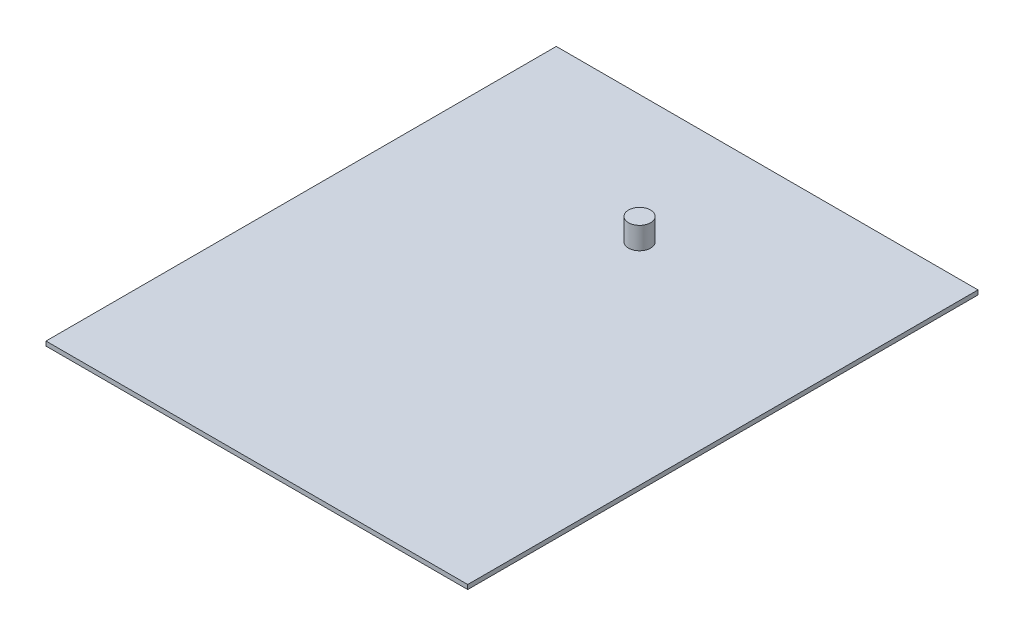
ISO-10303-21;
HEADER;
FILE_DESCRIPTION(('STEP AP214'),'2;1');
FILE_NAME('part.step','',(''),(''),'','','');
FILE_SCHEMA(('AUTOMOTIVE_DESIGN { 1 0 10303 214 1 1 1 1 }'));
ENDSEC;
DATA;
#1=APPLICATION_CONTEXT('core data for automotive mechanical design processes');
#2=APPLICATION_PROTOCOL_DEFINITION('international standard','automotive_design',2000,#1);
#3=PRODUCT_CONTEXT('',#1,'mechanical');
#4=PRODUCT('Part','Part','',(#3));
#5=PRODUCT_RELATED_PRODUCT_CATEGORY('part','',(#4));
#6=PRODUCT_DEFINITION_FORMATION('','',#4);
#7=PRODUCT_DEFINITION_CONTEXT('part definition',#1,'design');
#8=PRODUCT_DEFINITION('design','',#6,#7);
#9=PRODUCT_DEFINITION_SHAPE('','',#8);
#10=(LENGTH_UNIT() NAMED_UNIT(*) SI_UNIT(.MILLI.,.METRE.));
#11=(NAMED_UNIT(*) PLANE_ANGLE_UNIT() SI_UNIT($,.RADIAN.));
#12=(NAMED_UNIT(*) SI_UNIT($,.STERADIAN.) SOLID_ANGLE_UNIT());
#13=UNCERTAINTY_MEASURE_WITH_UNIT(LENGTH_MEASURE(1.E-05),#10,'distance_accuracy_value','');
#14=(GEOMETRIC_REPRESENTATION_CONTEXT(3) GLOBAL_UNCERTAINTY_ASSIGNED_CONTEXT((#13)) GLOBAL_UNIT_ASSIGNED_CONTEXT((#10,
#11,#12)) REPRESENTATION_CONTEXT('',''));
#15=CARTESIAN_POINT('',(0.,0.,0.));
#16=DIRECTION('',(0.,0.,1.));
#17=DIRECTION('',(1.,0.,0.));
#18=AXIS2_PLACEMENT_3D('',#15,#16,#17);
#19=CARTESIAN_POINT('',(-95.7,2.,115.8));
#20=DIRECTION('',(1.,0.,0.));
#21=DIRECTION('',(0.,0.,-1.));
#22=AXIS2_PLACEMENT_3D('',#19,#20,#21);
#23=PLANE('',#22);
#24=DIRECTION('',(0.,0.,1.));
#25=VECTOR('',#24,1.);
#26=CARTESIAN_POINT('',(-95.7,0.,115.8));
#27=LINE('',#26,#25);
#28=CARTESIAN_POINT('',(-95.7,0.,-115.8));
#29=VERTEX_POINT('',#28);
#30=CARTESIAN_POINT('',(-95.7,0.,115.8));
#31=VERTEX_POINT('',#30);
#32=EDGE_CURVE('E111',#29,#31,#27,.T.);
#33=ORIENTED_EDGE('',*,*,#32,.T.);
#34=DIRECTION('',(0.,-1.,0.));
#35=VECTOR('',#34,1.);
#36=CARTESIAN_POINT('',(-95.7,2.,115.8));
#37=LINE('',#36,#35);
#38=CARTESIAN_POINT('',(-95.7,2.,115.8));
#39=VERTEX_POINT('',#38);
#40=EDGE_CURVE('E11',#39,#31,#37,.T.);
#41=ORIENTED_EDGE('',*,*,#40,.F.);
#42=DIRECTION('',(0.,0.,1.));
#43=VECTOR('',#42,1.);
#44=CARTESIAN_POINT('',(-95.7,2.,115.8));
#45=LINE('',#44,#43);
#46=CARTESIAN_POINT('',(-95.7,2.,-115.8));
#47=VERTEX_POINT('',#46);
#48=EDGE_CURVE('E95',#47,#39,#45,.T.);
#49=ORIENTED_EDGE('',*,*,#48,.F.);
#50=DIRECTION('',(0.,-1.,0.));
#51=VECTOR('',#50,1.);
#52=CARTESIAN_POINT('',(-95.7,2.,-115.8));
#53=LINE('',#52,#51);
#54=EDGE_CURVE('E107',#47,#29,#53,.T.);
#55=ORIENTED_EDGE('',*,*,#54,.T.);
#56=EDGE_LOOP('',(#33,#41,#49,#55));
#57=FACE_BOUND('',#56,.T.);
#58=ADVANCED_FACE('F43',(#57),#23,.F.);
#59=CARTESIAN_POINT('',(95.7,2.,115.8));
#60=DIRECTION('',(0.,0.,-1.));
#61=DIRECTION('',(-1.,0.,0.));
#62=AXIS2_PLACEMENT_3D('',#59,#60,#61);
#63=PLANE('',#62);
#64=DIRECTION('',(1.,0.,0.));
#65=VECTOR('',#64,1.);
#66=CARTESIAN_POINT('',(95.7,0.,115.8));
#67=LINE('',#66,#65);
#68=CARTESIAN_POINT('',(95.7,0.,115.8));
#69=VERTEX_POINT('',#68);
#70=EDGE_CURVE('E100',#31,#69,#67,.T.);
#71=ORIENTED_EDGE('',*,*,#70,.T.);
#72=DIRECTION('',(0.,-1.,0.));
#73=VECTOR('',#72,1.);
#74=CARTESIAN_POINT('',(95.7,2.,115.8));
#75=LINE('',#74,#73);
#76=CARTESIAN_POINT('',(95.7,2.,115.8));
#77=VERTEX_POINT('',#76);
#78=EDGE_CURVE('E52',#77,#69,#75,.T.);
#79=ORIENTED_EDGE('',*,*,#78,.F.);
#80=DIRECTION('',(1.,0.,0.));
#81=VECTOR('',#80,1.);
#82=CARTESIAN_POINT('',(95.7,2.,115.8));
#83=LINE('',#82,#81);
#84=EDGE_CURVE('E90',#39,#77,#83,.T.);
#85=ORIENTED_EDGE('',*,*,#84,.F.);
#86=ORIENTED_EDGE('',*,*,#40,.T.);
#87=EDGE_LOOP('',(#71,#79,#85,#86));
#88=FACE_BOUND('',#87,.T.);
#89=ADVANCED_FACE('F99',(#88),#63,.F.);
#90=CARTESIAN_POINT('',(95.7,2.,115.8));
#91=DIRECTION('',(-1.,0.,0.));
#92=DIRECTION('',(0.,0.,1.));
#93=AXIS2_PLACEMENT_3D('',#90,#91,#92);
#94=PLANE('',#93);
#95=DIRECTION('',(0.,0.,-1.));
#96=VECTOR('',#95,1.);
#97=CARTESIAN_POINT('',(95.7,0.,115.8));
#98=LINE('',#97,#96);
#99=CARTESIAN_POINT('',(95.7,0.,-115.8));
#100=VERTEX_POINT('',#99);
#101=EDGE_CURVE('E77',#69,#100,#98,.T.);
#102=ORIENTED_EDGE('',*,*,#101,.T.);
#103=DIRECTION('',(0.,-1.,0.));
#104=VECTOR('',#103,1.);
#105=CARTESIAN_POINT('',(95.7,2.,-115.8));
#106=LINE('',#105,#104);
#107=CARTESIAN_POINT('',(95.7,2.,-115.8));
#108=VERTEX_POINT('',#107);
#109=EDGE_CURVE('E102',#108,#100,#106,.T.);
#110=ORIENTED_EDGE('',*,*,#109,.F.);
#111=DIRECTION('',(0.,0.,-1.));
#112=VECTOR('',#111,1.);
#113=CARTESIAN_POINT('',(95.7,2.,115.8));
#114=LINE('',#113,#112);
#115=EDGE_CURVE('E93',#77,#108,#114,.T.);
#116=ORIENTED_EDGE('',*,*,#115,.F.);
#117=ORIENTED_EDGE('',*,*,#78,.T.);
#118=EDGE_LOOP('',(#102,#110,#116,#117));
#119=FACE_BOUND('',#118,.T.);
#120=ADVANCED_FACE('F103',(#119),#94,.F.);
#121=CARTESIAN_POINT('',(95.7,2.,-115.8));
#122=DIRECTION('',(0.,0.,1.));
#123=DIRECTION('',(1.,0.,0.));
#124=AXIS2_PLACEMENT_3D('',#121,#122,#123);
#125=PLANE('',#124);
#126=DIRECTION('',(-1.,0.,0.));
#127=VECTOR('',#126,1.);
#128=CARTESIAN_POINT('',(95.7,0.,-115.8));
#129=LINE('',#128,#127);
#130=EDGE_CURVE('E83',#100,#29,#129,.T.);
#131=ORIENTED_EDGE('',*,*,#130,.T.);
#132=ORIENTED_EDGE('',*,*,#54,.F.);
#133=DIRECTION('',(-1.,0.,0.));
#134=VECTOR('',#133,1.);
#135=CARTESIAN_POINT('',(95.7,2.,-115.8));
#136=LINE('',#135,#134);
#137=EDGE_CURVE('E60',#108,#47,#136,.T.);
#138=ORIENTED_EDGE('',*,*,#137,.F.);
#139=ORIENTED_EDGE('',*,*,#109,.T.);
#140=EDGE_LOOP('',(#131,#132,#138,#139));
#141=FACE_BOUND('',#140,.T.);
#142=ADVANCED_FACE('F125',(#141),#125,.F.);
#143=CARTESIAN_POINT('',(0.,2.,0.));
#144=DIRECTION('',(0.,1.,0.));
#145=DIRECTION('',(0.,0.,1.));
#146=AXIS2_PLACEMENT_3D('',#143,#144,#145);
#147=PLANE('',#146);
#148=CARTESIAN_POINT('',(0.,2.,-57.9));
#149=DIRECTION('',(0.,1.,0.));
#150=DIRECTION('',(0.,0.,-1.));
#151=AXIS2_PLACEMENT_3D('',#148,#149,#150);
#152=CIRCLE('',#151,5.);
#153=CARTESIAN_POINT('',(0.,2.,-62.9));
#154=VERTEX_POINT('',#153);
#155=EDGE_CURVE('E132',#154,#154,#152,.T.);
#156=ORIENTED_EDGE('',*,*,#155,.F.);
#157=EDGE_LOOP('',(#156));
#158=FACE_BOUND('',#157,.T.);
#159=ORIENTED_EDGE('',*,*,#48,.T.);
#160=ORIENTED_EDGE('',*,*,#84,.T.);
#161=ORIENTED_EDGE('',*,*,#115,.T.);
#162=ORIENTED_EDGE('',*,*,#137,.T.);
#163=EDGE_LOOP('',(#159,#160,#161,#162));
#164=FACE_BOUND('',#163,.T.);
#165=ADVANCED_FACE('F91',(#158,#164),#147,.T.);
#166=CARTESIAN_POINT('',(0.,0.,0.));
#167=DIRECTION('',(0.,1.,0.));
#168=DIRECTION('',(0.,0.,1.));
#169=AXIS2_PLACEMENT_3D('',#166,#167,#168);
#170=PLANE('',#169);
#171=ORIENTED_EDGE('',*,*,#32,.F.);
#172=ORIENTED_EDGE('',*,*,#130,.F.);
#173=ORIENTED_EDGE('',*,*,#101,.F.);
#174=ORIENTED_EDGE('',*,*,#70,.F.);
#175=EDGE_LOOP('',(#171,#172,#173,#174));
#176=FACE_BOUND('',#175,.T.);
#177=ADVANCED_FACE('F128',(#176),#170,.F.);
#178=CARTESIAN_POINT('',(0.,12.,-57.9));
#179=DIRECTION('',(0.,-1.,0.));
#180=DIRECTION('',(0.,0.,-1.));
#181=AXIS2_PLACEMENT_3D('',#178,#179,#180);
#182=CYLINDRICAL_SURFACE('',#181,5.);
#183=CARTESIAN_POINT('',(0.,12.,-57.9));
#184=DIRECTION('',(0.,1.,0.));
#185=DIRECTION('',(0.,0.,-1.));
#186=AXIS2_PLACEMENT_3D('',#183,#184,#185);
#187=CIRCLE('',#186,5.);
#188=CARTESIAN_POINT('',(0.,12.,-62.9));
#189=VERTEX_POINT('',#188);
#190=EDGE_CURVE('E115',#189,#189,#187,.T.);
#191=ORIENTED_EDGE('',*,*,#190,.F.);
#192=EDGE_LOOP('',(#191));
#193=FACE_BOUND('',#192,.T.);
#194=ORIENTED_EDGE('',*,*,#155,.T.);
#195=EDGE_LOOP('',(#194));
#196=FACE_BOUND('',#195,.T.);
#197=ADVANCED_FACE('F142',(#193,#196),#182,.T.);
#198=CARTESIAN_POINT('',(0.,12.,-57.9));
#199=DIRECTION('',(0.,-1.,0.));
#200=DIRECTION('',(0.,0.,-1.));
#201=AXIS2_PLACEMENT_3D('',#198,#199,#200);
#202=PLANE('',#201);
#203=ORIENTED_EDGE('',*,*,#190,.T.);
#204=EDGE_LOOP('',(#203));
#205=FACE_BOUND('',#204,.T.);
#206=ADVANCED_FACE('F140',(#205),#202,.F.);
#207=CLOSED_SHELL('',(#58,#89,#120,#142,#165,#177,#197,#206));
#208=MANIFOLD_SOLID_BREP('B2',#207);
#209=ADVANCED_BREP_SHAPE_REPRESENTATION('',(#18,#208),#14);
#210=SHAPE_DEFINITION_REPRESENTATION(#9,#209);
ENDSEC;
END-ISO-10303-21;
